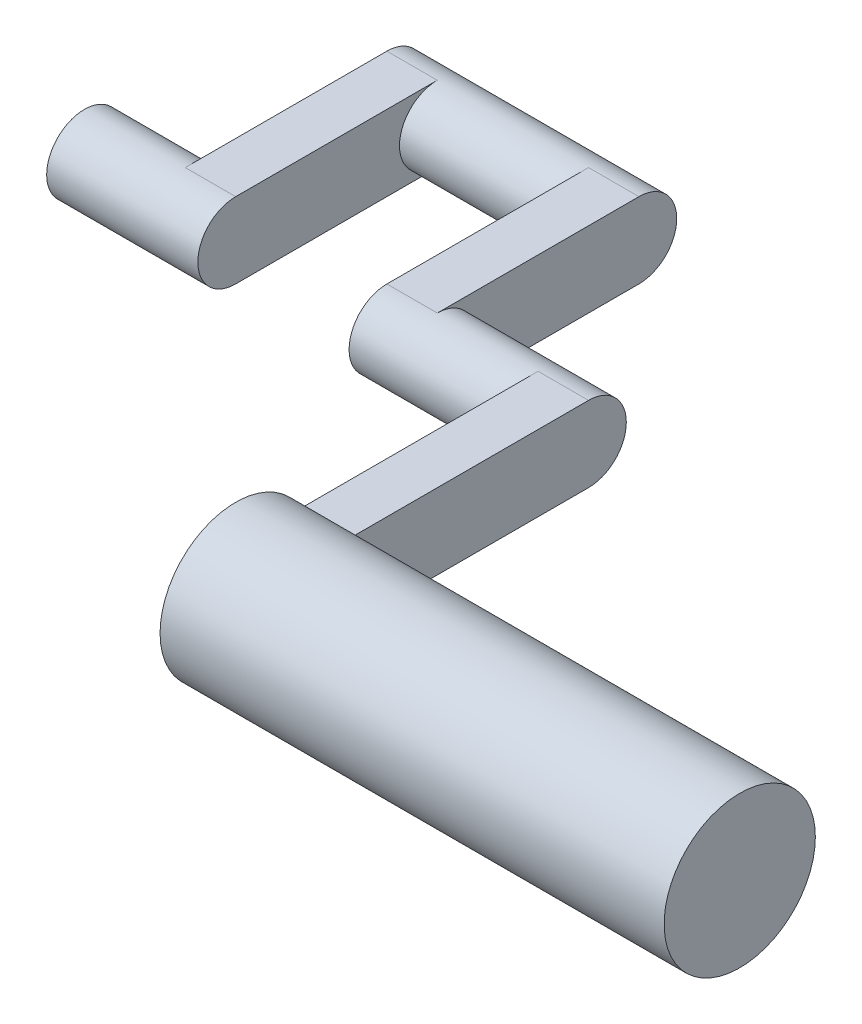
ISO-10303-21;
HEADER;
FILE_DESCRIPTION(('STEP AP214'),'2;1');
FILE_NAME('part.step','',(''),(''),'','','');
FILE_SCHEMA(('AUTOMOTIVE_DESIGN { 1 0 10303 214 1 1 1 1 }'));
ENDSEC;
DATA;
#1=APPLICATION_CONTEXT('core data for automotive mechanical design processes');
#2=APPLICATION_PROTOCOL_DEFINITION('international standard','automotive_design',2000,#1);
#3=PRODUCT_CONTEXT('',#1,'mechanical');
#4=PRODUCT('Part','Part','',(#3));
#5=PRODUCT_RELATED_PRODUCT_CATEGORY('part','',(#4));
#6=PRODUCT_DEFINITION_FORMATION('','',#4);
#7=PRODUCT_DEFINITION_CONTEXT('part definition',#1,'design');
#8=PRODUCT_DEFINITION('design','',#6,#7);
#9=PRODUCT_DEFINITION_SHAPE('','',#8);
#10=(LENGTH_UNIT() NAMED_UNIT(*) SI_UNIT(.MILLI.,.METRE.));
#11=(NAMED_UNIT(*) PLANE_ANGLE_UNIT() SI_UNIT($,.RADIAN.));
#12=(NAMED_UNIT(*) SI_UNIT($,.STERADIAN.) SOLID_ANGLE_UNIT());
#13=UNCERTAINTY_MEASURE_WITH_UNIT(LENGTH_MEASURE(1.E-05),#10,'distance_accuracy_value','');
#14=(GEOMETRIC_REPRESENTATION_CONTEXT(3) GLOBAL_UNCERTAINTY_ASSIGNED_CONTEXT((#13)) GLOBAL_UNIT_ASSIGNED_CONTEXT((#10,
#11,#12)) REPRESENTATION_CONTEXT('',''));
#15=CARTESIAN_POINT('',(0.,0.,0.));
#16=DIRECTION('',(0.,0.,1.));
#17=DIRECTION('',(1.,0.,0.));
#18=AXIS2_PLACEMENT_3D('',#15,#16,#17);
#19=CARTESIAN_POINT('',(-152.4,0.,-127.));
#20=DIRECTION('',(-1.,0.,0.));
#21=DIRECTION('',(0.,0.,1.));
#22=AXIS2_PLACEMENT_3D('',#19,#20,#21);
#23=CYLINDRICAL_SURFACE('',#22,9.52500000000001);
#24=DIRECTION('',(-1.,0.,0.));
#25=VECTOR('',#24,1.);
#26=CARTESIAN_POINT('',(-152.4,-9.52500000000001,-127.));
#27=LINE('',#26,#25);
#28=CARTESIAN_POINT('',(-152.4,-9.52500000000001,-127.));
#29=VERTEX_POINT('',#28);
#30=CARTESIAN_POINT('',(-165.1,-9.52500000000001,-127.));
#31=VERTEX_POINT('',#30);
#32=EDGE_CURVE('E188',#29,#31,#27,.T.);
#33=ORIENTED_EDGE('',*,*,#32,.T.);
#34=CARTESIAN_POINT('',(-165.1,0.,-127.));
#35=DIRECTION('',(-1.,0.,0.));
#36=DIRECTION('',(0.,0.,1.));
#37=AXIS2_PLACEMENT_3D('',#34,#35,#36);
#38=CIRCLE('',#37,9.52500000000001);
#39=CARTESIAN_POINT('',(-165.1,9.52500000000001,-127.));
#40=VERTEX_POINT('',#39);
#41=EDGE_CURVE('E11',#31,#40,#38,.T.);
#42=ORIENTED_EDGE('',*,*,#41,.T.);
#43=DIRECTION('',(-1.,0.,0.));
#44=VECTOR('',#43,1.);
#45=CARTESIAN_POINT('',(-152.4,9.52500000000001,-127.));
#46=LINE('',#45,#44);
#47=CARTESIAN_POINT('',(-152.4,9.52500000000001,-127.));
#48=VERTEX_POINT('',#47);
#49=EDGE_CURVE('E179',#48,#40,#46,.T.);
#50=ORIENTED_EDGE('',*,*,#49,.F.);
#51=CARTESIAN_POINT('',(-152.4,0.,-127.));
#52=DIRECTION('',(-1.,0.,0.));
#53=DIRECTION('',(0.,0.,1.));
#54=AXIS2_PLACEMENT_3D('',#51,#52,#53);
#55=CIRCLE('',#54,9.52500000000001);
#56=EDGE_CURVE('E171',#48,#29,#55,.T.);
#57=ORIENTED_EDGE('',*,*,#56,.T.);
#58=EDGE_LOOP('',(#33,#42,#50,#57));
#59=FACE_BOUND('',#58,.T.);
#60=CARTESIAN_POINT('',(-215.9,0.,-127.));
#61=DIRECTION('',(-1.,0.,0.));
#62=DIRECTION('',(0.,0.,1.));
#63=AXIS2_PLACEMENT_3D('',#60,#61,#62);
#64=CIRCLE('',#63,9.52500000000001);
#65=CARTESIAN_POINT('',(-215.9,9.52500000000001,-127.));
#66=VERTEX_POINT('',#65);
#67=CARTESIAN_POINT('',(-215.9,-9.52500000000001,-127.));
#68=VERTEX_POINT('',#67);
#69=EDGE_CURVE('E162',#66,#68,#64,.T.);
#70=ORIENTED_EDGE('',*,*,#69,.F.);
#71=DIRECTION('',(-1.,0.,0.));
#72=VECTOR('',#71,1.);
#73=CARTESIAN_POINT('',(-203.2,9.52500000000001,-127.));
#74=LINE('',#73,#72);
#75=CARTESIAN_POINT('',(-203.2,9.52500000000001,-127.));
#76=VERTEX_POINT('',#75);
#77=EDGE_CURVE('E51',#76,#66,#74,.T.);
#78=ORIENTED_EDGE('',*,*,#77,.F.);
#79=CARTESIAN_POINT('',(-203.2,0.,-127.));
#80=DIRECTION('',(-1.,0.,0.));
#81=DIRECTION('',(0.,0.,1.));
#82=AXIS2_PLACEMENT_3D('',#79,#80,#81);
#83=CIRCLE('',#82,9.52500000000001);
#84=CARTESIAN_POINT('',(-203.2,-9.52500000000001,-127.));
#85=VERTEX_POINT('',#84);
#86=EDGE_CURVE('E133',#85,#76,#83,.T.);
#87=ORIENTED_EDGE('',*,*,#86,.F.);
#88=DIRECTION('',(-1.,0.,0.));
#89=VECTOR('',#88,1.);
#90=CARTESIAN_POINT('',(-203.2,-9.52500000000001,-127.));
#91=LINE('',#90,#89);
#92=EDGE_CURVE('E160',#85,#68,#91,.T.);
#93=ORIENTED_EDGE('',*,*,#92,.T.);
#94=EDGE_LOOP('',(#70,#78,#87,#93));
#95=FACE_BOUND('',#94,.T.);
#96=ADVANCED_FACE('F34',(#59,#95),#23,.T.);
#97=CARTESIAN_POINT('',(-127.,0.,0.));
#98=DIRECTION('',(1.,0.,0.));
#99=DIRECTION('',(0.,0.,-1.));
#100=AXIS2_PLACEMENT_3D('',#97,#98,#99);
#101=CYLINDRICAL_SURFACE('',#100,19.05);
#102=CARTESIAN_POINT('',(0.,0.,0.));
#103=DIRECTION('',(1.,0.,0.));
#104=DIRECTION('',(0.,0.,-1.));
#105=AXIS2_PLACEMENT_3D('',#102,#103,#104);
#106=CIRCLE('',#105,19.05);
#107=CARTESIAN_POINT('',(0.,0.,-19.05));
#108=VERTEX_POINT('',#107);
#109=EDGE_CURVE('E221',#108,#108,#106,.T.);
#110=ORIENTED_EDGE('',*,*,#109,.F.);
#111=EDGE_LOOP('',(#110));
#112=FACE_BOUND('',#111,.T.);
#113=CARTESIAN_POINT('',(-114.3,0.,0.));
#114=DIRECTION('',(-1.,0.,0.));
#115=DIRECTION('',(0.,0.,1.));
#116=AXIS2_PLACEMENT_3D('',#113,#114,#115);
#117=CIRCLE('',#116,19.05);
#118=CARTESIAN_POINT('',(-114.3,-9.525,-16.4977839420936));
#119=VERTEX_POINT('',#118);
#120=CARTESIAN_POINT('',(-114.3,9.525,-16.4977839420936));
#121=VERTEX_POINT('',#120);
#122=EDGE_CURVE('E38',#119,#121,#117,.F.);
#123=ORIENTED_EDGE('',*,*,#122,.T.);
#124=DIRECTION('',(1.,0.,0.));
#125=VECTOR('',#124,1.);
#126=CARTESIAN_POINT('',(-127.,9.525,-16.4977839420936));
#127=LINE('',#126,#125);
#128=CARTESIAN_POINT('',(-127.,9.525,-16.4977839420936));
#129=VERTEX_POINT('',#128);
#130=EDGE_CURVE('E218',#121,#129,#127,.F.);
#131=ORIENTED_EDGE('',*,*,#130,.T.);
#132=CARTESIAN_POINT('',(-127.,0.,0.));
#133=DIRECTION('',(1.,0.,0.));
#134=DIRECTION('',(0.,0.,-1.));
#135=AXIS2_PLACEMENT_3D('',#132,#133,#134);
#136=CIRCLE('',#135,19.05);
#137=CARTESIAN_POINT('',(-127.,-9.525,-16.4977839420936));
#138=VERTEX_POINT('',#137);
#139=EDGE_CURVE('E222',#129,#138,#136,.T.);
#140=ORIENTED_EDGE('',*,*,#139,.T.);
#141=DIRECTION('',(1.,0.,0.));
#142=VECTOR('',#141,1.);
#143=CARTESIAN_POINT('',(-127.,-9.525,-16.4977839420936));
#144=LINE('',#143,#142);
#145=EDGE_CURVE('E214',#138,#119,#144,.T.);
#146=ORIENTED_EDGE('',*,*,#145,.T.);
#147=EDGE_LOOP('',(#123,#131,#140,#146));
#148=FACE_BOUND('',#147,.T.);
#149=ADVANCED_FACE('F36',(#112,#148),#101,.T.);
#150=CARTESIAN_POINT('',(-127.,0.,0.));
#151=DIRECTION('',(1.,0.,0.));
#152=DIRECTION('',(0.,0.,-1.));
#153=AXIS2_PLACEMENT_3D('',#150,#151,#152);
#154=PLANE('',#153);
#155=CARTESIAN_POINT('',(-127.,0.,-76.2));
#156=DIRECTION('',(-1.,0.,0.));
#157=DIRECTION('',(0.,0.,1.));
#158=AXIS2_PLACEMENT_3D('',#155,#156,#157);
#159=CIRCLE('',#158,9.52500000000001);
#160=CARTESIAN_POINT('',(-127.,-9.52500000000001,-76.2));
#161=VERTEX_POINT('',#160);
#162=CARTESIAN_POINT('',(-127.,9.52500000000001,-76.2));
#163=VERTEX_POINT('',#162);
#164=EDGE_CURVE('E43',#161,#163,#159,.T.);
#165=ORIENTED_EDGE('',*,*,#164,.F.);
#166=DIRECTION('',(0.,0.,-1.));
#167=VECTOR('',#166,1.);
#168=CARTESIAN_POINT('',(-127.,-9.525,0.));
#169=LINE('',#168,#167);
#170=EDGE_CURVE('E201',#138,#161,#169,.T.);
#171=ORIENTED_EDGE('',*,*,#170,.F.);
#172=ORIENTED_EDGE('',*,*,#139,.F.);
#173=DIRECTION('',(0.,0.,1.));
#174=VECTOR('',#173,1.);
#175=CARTESIAN_POINT('',(-127.,9.525,0.));
#176=LINE('',#175,#174);
#177=EDGE_CURVE('E194',#163,#129,#176,.T.);
#178=ORIENTED_EDGE('',*,*,#177,.F.);
#179=EDGE_LOOP('',(#165,#171,#172,#178));
#180=FACE_BOUND('',#179,.T.);
#181=ADVANCED_FACE('F230',(#180),#154,.F.);
#182=CARTESIAN_POINT('',(0.,0.,0.));
#183=DIRECTION('',(1.,0.,0.));
#184=DIRECTION('',(0.,0.,-1.));
#185=AXIS2_PLACEMENT_3D('',#182,#183,#184);
#186=PLANE('',#185);
#187=ORIENTED_EDGE('',*,*,#109,.T.);
#188=EDGE_LOOP('',(#187));
#189=FACE_BOUND('',#188,.T.);
#190=ADVANCED_FACE('F226',(#189),#186,.T.);
#191=CARTESIAN_POINT('',(-114.3,9.525,0.));
#192=DIRECTION('',(0.,-1.,0.));
#193=DIRECTION('',(0.,0.,-1.));
#194=AXIS2_PLACEMENT_3D('',#191,#192,#193);
#195=PLANE('',#194);
#196=ORIENTED_EDGE('',*,*,#130,.F.);
#197=DIRECTION('',(0.,0.,1.));
#198=VECTOR('',#197,1.);
#199=CARTESIAN_POINT('',(-114.3,9.525,0.));
#200=LINE('',#199,#198);
#201=CARTESIAN_POINT('',(-114.3,9.52500000000001,-76.2));
#202=VERTEX_POINT('',#201);
#203=EDGE_CURVE('E197',#202,#121,#200,.T.);
#204=ORIENTED_EDGE('',*,*,#203,.F.);
#205=DIRECTION('',(-1.,0.,0.));
#206=VECTOR('',#205,1.);
#207=CARTESIAN_POINT('',(-114.3,9.52500000000001,-76.2));
#208=LINE('',#207,#206);
#209=EDGE_CURVE('E206',#202,#163,#208,.T.);
#210=ORIENTED_EDGE('',*,*,#209,.T.);
#211=ORIENTED_EDGE('',*,*,#177,.T.);
#212=EDGE_LOOP('',(#196,#204,#210,#211));
#213=FACE_BOUND('',#212,.T.);
#214=ADVANCED_FACE('F238',(#213),#195,.F.);
#215=CARTESIAN_POINT('',(-114.3,-9.525,0.));
#216=DIRECTION('',(0.,1.,0.));
#217=DIRECTION('',(0.,0.,1.));
#218=AXIS2_PLACEMENT_3D('',#215,#216,#217);
#219=PLANE('',#218);
#220=ORIENTED_EDGE('',*,*,#145,.F.);
#221=ORIENTED_EDGE('',*,*,#170,.T.);
#222=DIRECTION('',(-1.,0.,0.));
#223=VECTOR('',#222,1.);
#224=CARTESIAN_POINT('',(-114.3,-9.52500000000001,-76.2));
#225=LINE('',#224,#223);
#226=CARTESIAN_POINT('',(-114.3,-9.52500000000001,-76.2));
#227=VERTEX_POINT('',#226);
#228=EDGE_CURVE('E211',#227,#161,#225,.T.);
#229=ORIENTED_EDGE('',*,*,#228,.F.);
#230=DIRECTION('',(0.,0.,-1.));
#231=VECTOR('',#230,1.);
#232=CARTESIAN_POINT('',(-114.3,-9.525,0.));
#233=LINE('',#232,#231);
#234=EDGE_CURVE('E204',#119,#227,#233,.T.);
#235=ORIENTED_EDGE('',*,*,#234,.F.);
#236=EDGE_LOOP('',(#220,#221,#229,#235));
#237=FACE_BOUND('',#236,.T.);
#238=ADVANCED_FACE('F247',(#237),#219,.F.);
#239=CARTESIAN_POINT('',(-114.3,0.,-76.2));
#240=DIRECTION('',(-1.,0.,0.));
#241=DIRECTION('',(0.,0.,1.));
#242=AXIS2_PLACEMENT_3D('',#239,#240,#241);
#243=CYLINDRICAL_SURFACE('',#242,9.52500000000001);
#244=DIRECTION('',(-1.,0.,0.));
#245=VECTOR('',#244,1.);
#246=CARTESIAN_POINT('',(-152.4,9.52500000000001,-76.2));
#247=LINE('',#246,#245);
#248=CARTESIAN_POINT('',(-152.4,9.52500000000001,-76.2));
#249=VERTEX_POINT('',#248);
#250=CARTESIAN_POINT('',(-165.1,9.52500000000001,-76.2));
#251=VERTEX_POINT('',#250);
#252=EDGE_CURVE('E182',#249,#251,#247,.T.);
#253=ORIENTED_EDGE('',*,*,#252,.T.);
#254=CARTESIAN_POINT('',(-165.1,0.,-76.2));
#255=DIRECTION('',(-1.,0.,0.));
#256=DIRECTION('',(0.,0.,1.));
#257=AXIS2_PLACEMENT_3D('',#254,#255,#256);
#258=CIRCLE('',#257,9.52500000000001);
#259=CARTESIAN_POINT('',(-165.1,-9.52500000000001,-76.2));
#260=VERTEX_POINT('',#259);
#261=EDGE_CURVE('E185',#260,#251,#258,.T.);
#262=ORIENTED_EDGE('',*,*,#261,.F.);
#263=DIRECTION('',(-1.,0.,0.));
#264=VECTOR('',#263,1.);
#265=CARTESIAN_POINT('',(-152.4,-9.52500000000001,-76.2));
#266=LINE('',#265,#264);
#267=CARTESIAN_POINT('',(-152.4,-9.52500000000001,-76.2));
#268=VERTEX_POINT('',#267);
#269=EDGE_CURVE('E186',#268,#260,#266,.T.);
#270=ORIENTED_EDGE('',*,*,#269,.F.);
#271=CARTESIAN_POINT('',(-152.4,0.,-76.2));
#272=DIRECTION('',(-1.,0.,0.));
#273=DIRECTION('',(0.,0.,1.));
#274=AXIS2_PLACEMENT_3D('',#271,#272,#273);
#275=CIRCLE('',#274,9.52500000000001);
#276=EDGE_CURVE('E177',#249,#268,#275,.T.);
#277=ORIENTED_EDGE('',*,*,#276,.F.);
#278=EDGE_LOOP('',(#253,#262,#270,#277));
#279=FACE_BOUND('',#278,.T.);
#280=ORIENTED_EDGE('',*,*,#228,.T.);
#281=ORIENTED_EDGE('',*,*,#164,.T.);
#282=ORIENTED_EDGE('',*,*,#209,.F.);
#283=CARTESIAN_POINT('',(-114.3,0.,-76.2));
#284=DIRECTION('',(-1.,0.,0.));
#285=DIRECTION('',(0.,0.,1.));
#286=AXIS2_PLACEMENT_3D('',#283,#284,#285);
#287=CIRCLE('',#286,9.52500000000001);
#288=EDGE_CURVE('E200',#202,#227,#287,.T.);
#289=ORIENTED_EDGE('',*,*,#288,.T.);
#290=EDGE_LOOP('',(#280,#281,#282,#289));
#291=FACE_BOUND('',#290,.T.);
#292=ADVANCED_FACE('F243',(#279,#291),#243,.T.);
#293=CARTESIAN_POINT('',(-114.3,0.,0.));
#294=DIRECTION('',(-1.,0.,0.));
#295=DIRECTION('',(0.,0.,1.));
#296=AXIS2_PLACEMENT_3D('',#293,#294,#295);
#297=PLANE('',#296);
#298=ORIENTED_EDGE('',*,*,#122,.F.);
#299=ORIENTED_EDGE('',*,*,#234,.T.);
#300=ORIENTED_EDGE('',*,*,#288,.F.);
#301=ORIENTED_EDGE('',*,*,#203,.T.);
#302=EDGE_LOOP('',(#298,#299,#300,#301));
#303=FACE_BOUND('',#302,.T.);
#304=ADVANCED_FACE('F240',(#303),#297,.F.);
#305=CARTESIAN_POINT('',(-165.1,0.,0.));
#306=DIRECTION('',(-1.,0.,0.));
#307=DIRECTION('',(0.,0.,1.));
#308=AXIS2_PLACEMENT_3D('',#305,#306,#307);
#309=PLANE('',#308);
#310=ORIENTED_EDGE('',*,*,#41,.F.);
#311=DIRECTION('',(0.,0.,1.));
#312=VECTOR('',#311,1.);
#313=CARTESIAN_POINT('',(-165.1,-9.52500000000001,0.));
#314=LINE('',#313,#312);
#315=EDGE_CURVE('E59',#31,#260,#314,.T.);
#316=ORIENTED_EDGE('',*,*,#315,.T.);
#317=ORIENTED_EDGE('',*,*,#261,.T.);
#318=DIRECTION('',(0.,0.,1.));
#319=VECTOR('',#318,1.);
#320=CARTESIAN_POINT('',(-165.1,9.52500000000001,0.));
#321=LINE('',#320,#319);
#322=EDGE_CURVE('E167',#40,#251,#321,.T.);
#323=ORIENTED_EDGE('',*,*,#322,.F.);
#324=EDGE_LOOP('',(#310,#316,#317,#323));
#325=FACE_BOUND('',#324,.T.);
#326=ADVANCED_FACE('F271',(#325),#309,.T.);
#327=CARTESIAN_POINT('',(-152.4,9.52500000000001,0.));
#328=DIRECTION('',(0.,-1.,0.));
#329=DIRECTION('',(0.,0.,-1.));
#330=AXIS2_PLACEMENT_3D('',#327,#328,#329);
#331=PLANE('',#330);
#332=ORIENTED_EDGE('',*,*,#322,.T.);
#333=ORIENTED_EDGE('',*,*,#252,.F.);
#334=DIRECTION('',(0.,0.,1.));
#335=VECTOR('',#334,1.);
#336=CARTESIAN_POINT('',(-152.4,9.52500000000001,0.));
#337=LINE('',#336,#335);
#338=EDGE_CURVE('E169',#48,#249,#337,.T.);
#339=ORIENTED_EDGE('',*,*,#338,.F.);
#340=ORIENTED_EDGE('',*,*,#49,.T.);
#341=EDGE_LOOP('',(#332,#333,#339,#340));
#342=FACE_BOUND('',#341,.T.);
#343=ADVANCED_FACE('F268',(#342),#331,.F.);
#344=CARTESIAN_POINT('',(-152.4,-9.52500000000001,0.));
#345=DIRECTION('',(0.,-1.,0.));
#346=DIRECTION('',(0.,0.,-1.));
#347=AXIS2_PLACEMENT_3D('',#344,#345,#346);
#348=PLANE('',#347);
#349=ORIENTED_EDGE('',*,*,#315,.F.);
#350=ORIENTED_EDGE('',*,*,#32,.F.);
#351=DIRECTION('',(0.,0.,1.));
#352=VECTOR('',#351,1.);
#353=CARTESIAN_POINT('',(-152.4,-9.52500000000001,0.));
#354=LINE('',#353,#352);
#355=EDGE_CURVE('E174',#29,#268,#354,.T.);
#356=ORIENTED_EDGE('',*,*,#355,.T.);
#357=ORIENTED_EDGE('',*,*,#269,.T.);
#358=EDGE_LOOP('',(#349,#350,#356,#357));
#359=FACE_BOUND('',#358,.T.);
#360=ADVANCED_FACE('F266',(#359),#348,.T.);
#361=CARTESIAN_POINT('',(-152.4,0.,0.));
#362=DIRECTION('',(-1.,0.,0.));
#363=DIRECTION('',(0.,0.,1.));
#364=AXIS2_PLACEMENT_3D('',#361,#362,#363);
#365=PLANE('',#364);
#366=ORIENTED_EDGE('',*,*,#338,.T.);
#367=ORIENTED_EDGE('',*,*,#276,.T.);
#368=ORIENTED_EDGE('',*,*,#355,.F.);
#369=ORIENTED_EDGE('',*,*,#56,.F.);
#370=EDGE_LOOP('',(#366,#367,#368,#369));
#371=FACE_BOUND('',#370,.T.);
#372=ADVANCED_FACE('F296',(#371),#365,.F.);
#373=CARTESIAN_POINT('',(-215.9,0.,0.));
#374=DIRECTION('',(-1.,0.,0.));
#375=DIRECTION('',(0.,0.,1.));
#376=AXIS2_PLACEMENT_3D('',#373,#374,#375);
#377=PLANE('',#376);
#378=CARTESIAN_POINT('',(-215.9,0.,-76.2));
#379=DIRECTION('',(-1.,0.,0.));
#380=DIRECTION('',(0.,0.,1.));
#381=AXIS2_PLACEMENT_3D('',#378,#379,#380);
#382=CIRCLE('',#381,9.52500000000001);
#383=CARTESIAN_POINT('',(-215.9,9.52500000000001,-76.2));
#384=VERTEX_POINT('',#383);
#385=CARTESIAN_POINT('',(-215.9,-9.52500000000001,-76.2));
#386=VERTEX_POINT('',#385);
#387=EDGE_CURVE('E140',#384,#386,#382,.T.);
#388=ORIENTED_EDGE('',*,*,#387,.F.);
#389=DIRECTION('',(0.,0.,1.));
#390=VECTOR('',#389,1.);
#391=CARTESIAN_POINT('',(-215.9,9.52500000000001,0.));
#392=LINE('',#391,#390);
#393=EDGE_CURVE('E124',#66,#384,#392,.T.);
#394=ORIENTED_EDGE('',*,*,#393,.F.);
#395=ORIENTED_EDGE('',*,*,#69,.T.);
#396=DIRECTION('',(0.,0.,1.));
#397=VECTOR('',#396,1.);
#398=CARTESIAN_POINT('',(-215.9,-9.52500000000001,0.));
#399=LINE('',#398,#397);
#400=EDGE_CURVE('E134',#68,#386,#399,.T.);
#401=ORIENTED_EDGE('',*,*,#400,.T.);
#402=EDGE_LOOP('',(#388,#394,#395,#401));
#403=FACE_BOUND('',#402,.T.);
#404=ADVANCED_FACE('F146',(#403),#377,.T.);
#405=CARTESIAN_POINT('',(-203.2,9.52500000000001,0.));
#406=DIRECTION('',(0.,-1.,0.));
#407=DIRECTION('',(0.,0.,-1.));
#408=AXIS2_PLACEMENT_3D('',#405,#406,#407);
#409=PLANE('',#408);
#410=ORIENTED_EDGE('',*,*,#393,.T.);
#411=DIRECTION('',(-1.,0.,0.));
#412=VECTOR('',#411,1.);
#413=CARTESIAN_POINT('',(-203.2,9.52500000000001,-76.2));
#414=LINE('',#413,#412);
#415=CARTESIAN_POINT('',(-203.2,9.52500000000001,-76.2));
#416=VERTEX_POINT('',#415);
#417=EDGE_CURVE('E127',#416,#384,#414,.T.);
#418=ORIENTED_EDGE('',*,*,#417,.F.);
#419=DIRECTION('',(0.,0.,1.));
#420=VECTOR('',#419,1.);
#421=CARTESIAN_POINT('',(-203.2,9.52500000000001,0.));
#422=LINE('',#421,#420);
#423=EDGE_CURVE('E158',#76,#416,#422,.T.);
#424=ORIENTED_EDGE('',*,*,#423,.F.);
#425=ORIENTED_EDGE('',*,*,#77,.T.);
#426=EDGE_LOOP('',(#410,#418,#424,#425));
#427=FACE_BOUND('',#426,.T.);
#428=ADVANCED_FACE('F126',(#427),#409,.F.);
#429=CARTESIAN_POINT('',(-203.2,0.,-76.2));
#430=DIRECTION('',(-1.,0.,0.));
#431=DIRECTION('',(0.,0.,1.));
#432=AXIS2_PLACEMENT_3D('',#429,#430,#431);
#433=CYLINDRICAL_SURFACE('',#432,9.52500000000001);
#434=ORIENTED_EDGE('',*,*,#417,.T.);
#435=ORIENTED_EDGE('',*,*,#387,.T.);
#436=DIRECTION('',(-1.,0.,0.));
#437=VECTOR('',#436,1.);
#438=CARTESIAN_POINT('',(-203.2,-9.52500000000001,-76.2));
#439=LINE('',#438,#437);
#440=CARTESIAN_POINT('',(-203.2,-9.52500000000001,-76.2));
#441=VERTEX_POINT('',#440);
#442=EDGE_CURVE('E143',#441,#386,#439,.T.);
#443=ORIENTED_EDGE('',*,*,#442,.F.);
#444=CARTESIAN_POINT('',(-203.2,0.,-76.2));
#445=DIRECTION('',(-1.,0.,0.));
#446=DIRECTION('',(0.,0.,1.));
#447=AXIS2_PLACEMENT_3D('',#444,#445,#446);
#448=CIRCLE('',#447,9.52500000000001);
#449=EDGE_CURVE('E142',#441,#416,#448,.T.);
#450=ORIENTED_EDGE('',*,*,#449,.T.);
#451=EDGE_LOOP('',(#434,#435,#443,#450));
#452=FACE_BOUND('',#451,.T.);
#453=CARTESIAN_POINT('',(-241.3,0.,-76.2));
#454=DIRECTION('',(-1.,0.,0.));
#455=DIRECTION('',(0.,0.,1.));
#456=AXIS2_PLACEMENT_3D('',#453,#454,#455);
#457=CIRCLE('',#456,9.52500000000001);
#458=CARTESIAN_POINT('',(-241.3,0.,-66.675));
#459=VERTEX_POINT('',#458);
#460=EDGE_CURVE('E147',#459,#459,#457,.T.);
#461=ORIENTED_EDGE('',*,*,#460,.F.);
#462=EDGE_LOOP('',(#461));
#463=FACE_BOUND('',#462,.T.);
#464=ADVANCED_FACE('F138',(#452,#463),#433,.T.);
#465=CARTESIAN_POINT('',(-203.2,-9.52500000000001,0.));
#466=DIRECTION('',(0.,-1.,0.));
#467=DIRECTION('',(0.,0.,-1.));
#468=AXIS2_PLACEMENT_3D('',#465,#466,#467);
#469=PLANE('',#468);
#470=ORIENTED_EDGE('',*,*,#400,.F.);
#471=ORIENTED_EDGE('',*,*,#92,.F.);
#472=DIRECTION('',(0.,0.,1.));
#473=VECTOR('',#472,1.);
#474=CARTESIAN_POINT('',(-203.2,-9.52500000000001,0.));
#475=LINE('',#474,#473);
#476=EDGE_CURVE('E154',#85,#441,#475,.T.);
#477=ORIENTED_EDGE('',*,*,#476,.T.);
#478=ORIENTED_EDGE('',*,*,#442,.T.);
#479=EDGE_LOOP('',(#470,#471,#477,#478));
#480=FACE_BOUND('',#479,.T.);
#481=ADVANCED_FACE('F321',(#480),#469,.T.);
#482=CARTESIAN_POINT('',(-203.2,0.,0.));
#483=DIRECTION('',(-1.,0.,0.));
#484=DIRECTION('',(0.,0.,1.));
#485=AXIS2_PLACEMENT_3D('',#482,#483,#484);
#486=PLANE('',#485);
#487=ORIENTED_EDGE('',*,*,#86,.T.);
#488=ORIENTED_EDGE('',*,*,#423,.T.);
#489=ORIENTED_EDGE('',*,*,#449,.F.);
#490=ORIENTED_EDGE('',*,*,#476,.F.);
#491=EDGE_LOOP('',(#487,#488,#489,#490));
#492=FACE_BOUND('',#491,.T.);
#493=ADVANCED_FACE('F328',(#492),#486,.F.);
#494=CARTESIAN_POINT('',(-241.3,0.,-76.2));
#495=DIRECTION('',(-1.,0.,0.));
#496=DIRECTION('',(0.,0.,1.));
#497=AXIS2_PLACEMENT_3D('',#494,#495,#496);
#498=PLANE('',#497);
#499=ORIENTED_EDGE('',*,*,#460,.T.);
#500=EDGE_LOOP('',(#499));
#501=FACE_BOUND('',#500,.T.);
#502=ADVANCED_FACE('F336',(#501),#498,.T.);
#503=CLOSED_SHELL('',(#96,#149,#181,#190,#214,#238,#292,#304,#326,#343,#360,#372,#404,#428,#464,
#481,#493,#502));
#504=MANIFOLD_SOLID_BREP('B2',#503);
#505=ADVANCED_BREP_SHAPE_REPRESENTATION('',(#18,#504),#14);
#506=SHAPE_DEFINITION_REPRESENTATION(#9,#505);
ENDSEC;
END-ISO-10303-21;
